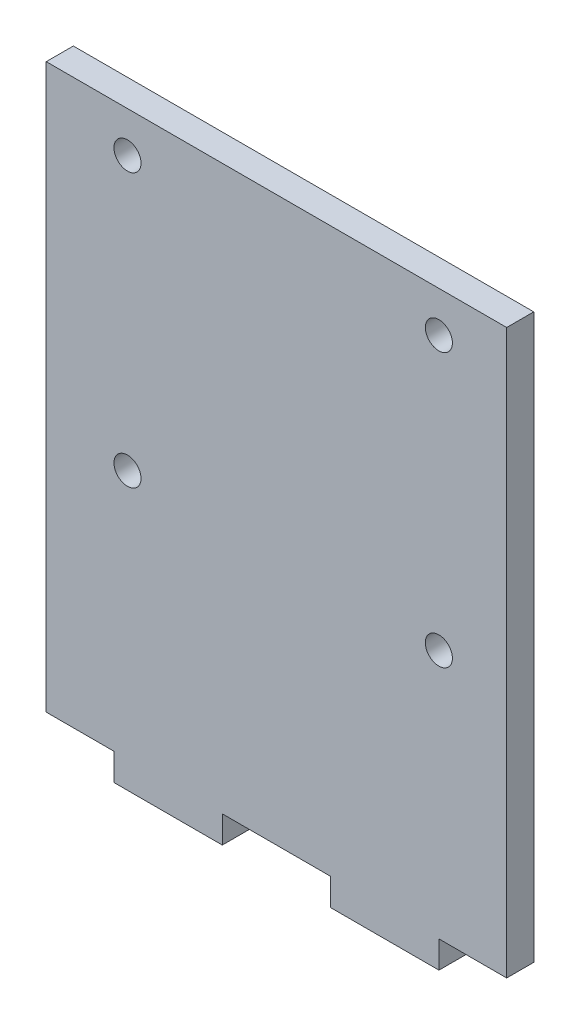
ISO-10303-21;
HEADER;
FILE_DESCRIPTION(('STEP AP214'),'2;1');
FILE_NAME('part.step','',(''),(''),'','','');
FILE_SCHEMA(('AUTOMOTIVE_DESIGN { 1 0 10303 214 1 1 1 1 }'));
ENDSEC;
DATA;
#1=APPLICATION_CONTEXT('core data for automotive mechanical design processes');
#2=APPLICATION_PROTOCOL_DEFINITION('international standard','automotive_design',2000,#1);
#3=PRODUCT_CONTEXT('',#1,'mechanical');
#4=PRODUCT('Part','Part','',(#3));
#5=PRODUCT_RELATED_PRODUCT_CATEGORY('part','',(#4));
#6=PRODUCT_DEFINITION_FORMATION('','',#4);
#7=PRODUCT_DEFINITION_CONTEXT('part definition',#1,'design');
#8=PRODUCT_DEFINITION('design','',#6,#7);
#9=PRODUCT_DEFINITION_SHAPE('','',#8);
#10=(LENGTH_UNIT() NAMED_UNIT(*) SI_UNIT(.MILLI.,.METRE.));
#11=(NAMED_UNIT(*) PLANE_ANGLE_UNIT() SI_UNIT($,.RADIAN.));
#12=(NAMED_UNIT(*) SI_UNIT($,.STERADIAN.) SOLID_ANGLE_UNIT());
#13=UNCERTAINTY_MEASURE_WITH_UNIT(LENGTH_MEASURE(1.E-05),#10,'distance_accuracy_value','');
#14=(GEOMETRIC_REPRESENTATION_CONTEXT(3) GLOBAL_UNCERTAINTY_ASSIGNED_CONTEXT((#13)) GLOBAL_UNIT_ASSIGNED_CONTEXT((#10,
#11,#12)) REPRESENTATION_CONTEXT('',''));
#15=CARTESIAN_POINT('',(0.,0.,0.));
#16=DIRECTION('',(0.,0.,1.));
#17=DIRECTION('',(1.,0.,0.));
#18=AXIS2_PLACEMENT_3D('',#15,#16,#17);
#19=CARTESIAN_POINT('',(53.975,0.,3.175));
#20=DIRECTION('',(-1.,0.,0.));
#21=DIRECTION('',(0.,0.,1.));
#22=AXIS2_PLACEMENT_3D('',#19,#20,#21);
#23=PLANE('',#22);
#24=DIRECTION('',(0.,1.,0.));
#25=VECTOR('',#24,1.);
#26=CARTESIAN_POINT('',(53.975,0.,0.));
#27=LINE('',#26,#25);
#28=CARTESIAN_POINT('',(53.975,0.,0.));
#29=VERTEX_POINT('',#28);
#30=CARTESIAN_POINT('',(53.975,66.04,0.));
#31=VERTEX_POINT('',#30);
#32=EDGE_CURVE('E165',#29,#31,#27,.T.);
#33=ORIENTED_EDGE('',*,*,#32,.T.);
#34=DIRECTION('',(0.,0.,-1.));
#35=VECTOR('',#34,1.);
#36=CARTESIAN_POINT('',(53.975,66.04,3.175));
#37=LINE('',#36,#35);
#38=CARTESIAN_POINT('',(53.975,66.04,3.175));
#39=VERTEX_POINT('',#38);
#40=EDGE_CURVE('E11',#39,#31,#37,.T.);
#41=ORIENTED_EDGE('',*,*,#40,.F.);
#42=DIRECTION('',(0.,1.,0.));
#43=VECTOR('',#42,1.);
#44=CARTESIAN_POINT('',(53.975,0.,3.175));
#45=LINE('',#44,#43);
#46=CARTESIAN_POINT('',(53.975,0.,3.175));
#47=VERTEX_POINT('',#46);
#48=EDGE_CURVE('E100',#47,#39,#45,.T.);
#49=ORIENTED_EDGE('',*,*,#48,.F.);
#50=DIRECTION('',(0.,0.,-1.));
#51=VECTOR('',#50,1.);
#52=CARTESIAN_POINT('',(53.975,0.,3.175));
#53=LINE('',#52,#51);
#54=EDGE_CURVE('E149',#47,#29,#53,.T.);
#55=ORIENTED_EDGE('',*,*,#54,.T.);
#56=EDGE_LOOP('',(#33,#41,#49,#55));
#57=FACE_BOUND('',#56,.T.);
#58=ADVANCED_FACE('F35',(#57),#23,.F.);
#59=CARTESIAN_POINT('',(0.,66.04,3.175));
#60=DIRECTION('',(0.,1.,0.));
#61=DIRECTION('',(-1.,0.,0.));
#62=AXIS2_PLACEMENT_3D('',#59,#60,#61);
#63=PLANE('',#62);
#64=DIRECTION('',(1.,0.,0.));
#65=VECTOR('',#64,1.);
#66=CARTESIAN_POINT('',(0.,66.04,0.));
#67=LINE('',#66,#65);
#68=CARTESIAN_POINT('',(0.,66.04,0.));
#69=VERTEX_POINT('',#68);
#70=EDGE_CURVE('E168',#69,#31,#67,.T.);
#71=ORIENTED_EDGE('',*,*,#70,.F.);
#72=DIRECTION('',(0.,0.,-1.));
#73=VECTOR('',#72,1.);
#74=CARTESIAN_POINT('',(0.,66.04,3.175));
#75=LINE('',#74,#73);
#76=CARTESIAN_POINT('',(0.,66.04,3.175));
#77=VERTEX_POINT('',#76);
#78=EDGE_CURVE('E44',#77,#69,#75,.T.);
#79=ORIENTED_EDGE('',*,*,#78,.F.);
#80=DIRECTION('',(1.,0.,0.));
#81=VECTOR('',#80,1.);
#82=CARTESIAN_POINT('',(0.,66.04,3.175));
#83=LINE('',#82,#81);
#84=EDGE_CURVE('E442',#77,#39,#83,.T.);
#85=ORIENTED_EDGE('',*,*,#84,.T.);
#86=ORIENTED_EDGE('',*,*,#40,.T.);
#87=EDGE_LOOP('',(#71,#79,#85,#86));
#88=FACE_BOUND('',#87,.T.);
#89=ADVANCED_FACE('F220',(#88),#63,.T.);
#90=CARTESIAN_POINT('',(0.,0.,3.175));
#91=DIRECTION('',(-1.,0.,0.));
#92=DIRECTION('',(0.,-1.,0.));
#93=AXIS2_PLACEMENT_3D('',#90,#91,#92);
#94=PLANE('',#93);
#95=DIRECTION('',(0.,1.,0.));
#96=VECTOR('',#95,1.);
#97=CARTESIAN_POINT('',(0.,0.,0.));
#98=LINE('',#97,#96);
#99=CARTESIAN_POINT('',(0.,0.,0.));
#100=VERTEX_POINT('',#99);
#101=EDGE_CURVE('E171',#100,#69,#98,.T.);
#102=ORIENTED_EDGE('',*,*,#101,.F.);
#103=DIRECTION('',(0.,0.,-1.));
#104=VECTOR('',#103,1.);
#105=CARTESIAN_POINT('',(0.,0.,3.175));
#106=LINE('',#105,#104);
#107=CARTESIAN_POINT('',(0.,0.,3.175));
#108=VERTEX_POINT('',#107);
#109=EDGE_CURVE('E210',#108,#100,#106,.T.);
#110=ORIENTED_EDGE('',*,*,#109,.F.);
#111=DIRECTION('',(0.,1.,0.));
#112=VECTOR('',#111,1.);
#113=CARTESIAN_POINT('',(0.,0.,3.175));
#114=LINE('',#113,#112);
#115=EDGE_CURVE('E217',#108,#77,#114,.T.);
#116=ORIENTED_EDGE('',*,*,#115,.T.);
#117=ORIENTED_EDGE('',*,*,#78,.T.);
#118=EDGE_LOOP('',(#102,#110,#116,#117));
#119=FACE_BOUND('',#118,.T.);
#120=ADVANCED_FACE('F215',(#119),#94,.T.);
#121=CARTESIAN_POINT('',(0.,0.,3.175));
#122=DIRECTION('',(0.,1.,0.));
#123=DIRECTION('',(0.,0.,1.));
#124=AXIS2_PLACEMENT_3D('',#121,#122,#123);
#125=PLANE('',#124);
#126=DIRECTION('',(1.,0.,0.));
#127=VECTOR('',#126,1.);
#128=CARTESIAN_POINT('',(0.,0.,0.));
#129=LINE('',#128,#127);
#130=CARTESIAN_POINT('',(7.9375,0.,0.));
#131=VERTEX_POINT('',#130);
#132=EDGE_CURVE('E174',#100,#131,#129,.T.);
#133=ORIENTED_EDGE('',*,*,#132,.T.);
#134=DIRECTION('',(0.,0.,-1.));
#135=VECTOR('',#134,1.);
#136=CARTESIAN_POINT('',(7.9375,0.,3.175));
#137=LINE('',#136,#135);
#138=CARTESIAN_POINT('',(7.9375,0.,3.175));
#139=VERTEX_POINT('',#138);
#140=EDGE_CURVE('E207',#139,#131,#137,.T.);
#141=ORIENTED_EDGE('',*,*,#140,.F.);
#142=DIRECTION('',(1.,0.,0.));
#143=VECTOR('',#142,1.);
#144=CARTESIAN_POINT('',(0.,0.,3.175));
#145=LINE('',#144,#143);
#146=EDGE_CURVE('E238',#108,#139,#145,.T.);
#147=ORIENTED_EDGE('',*,*,#146,.F.);
#148=ORIENTED_EDGE('',*,*,#109,.T.);
#149=EDGE_LOOP('',(#133,#141,#147,#148));
#150=FACE_BOUND('',#149,.T.);
#151=ADVANCED_FACE('F229',(#150),#125,.F.);
#152=CARTESIAN_POINT('',(7.9375,0.,3.175));
#153=DIRECTION('',(1.,0.,0.));
#154=DIRECTION('',(0.,1.,0.));
#155=AXIS2_PLACEMENT_3D('',#152,#153,#154);
#156=PLANE('',#155);
#157=DIRECTION('',(0.,-1.,0.));
#158=VECTOR('',#157,1.);
#159=CARTESIAN_POINT('',(7.9375,0.,0.));
#160=LINE('',#159,#158);
#161=CARTESIAN_POINT('',(7.9375,-3.175,0.));
#162=VERTEX_POINT('',#161);
#163=EDGE_CURVE('E176',#131,#162,#160,.T.);
#164=ORIENTED_EDGE('',*,*,#163,.T.);
#165=DIRECTION('',(0.,0.,-1.));
#166=VECTOR('',#165,1.);
#167=CARTESIAN_POINT('',(7.9375,-3.175,3.175));
#168=LINE('',#167,#166);
#169=CARTESIAN_POINT('',(7.9375,-3.175,3.175));
#170=VERTEX_POINT('',#169);
#171=EDGE_CURVE('E204',#170,#162,#168,.T.);
#172=ORIENTED_EDGE('',*,*,#171,.F.);
#173=DIRECTION('',(0.,-1.,0.));
#174=VECTOR('',#173,1.);
#175=CARTESIAN_POINT('',(7.9375,0.,3.175));
#176=LINE('',#175,#174);
#177=EDGE_CURVE('E235',#139,#170,#176,.T.);
#178=ORIENTED_EDGE('',*,*,#177,.F.);
#179=ORIENTED_EDGE('',*,*,#140,.T.);
#180=EDGE_LOOP('',(#164,#172,#178,#179));
#181=FACE_BOUND('',#180,.T.);
#182=ADVANCED_FACE('F233',(#181),#156,.F.);
#183=CARTESIAN_POINT('',(0.,-3.175,3.175));
#184=DIRECTION('',(0.,1.,0.));
#185=DIRECTION('',(0.,0.,1.));
#186=AXIS2_PLACEMENT_3D('',#183,#184,#185);
#187=PLANE('',#186);
#188=DIRECTION('',(1.,0.,0.));
#189=VECTOR('',#188,1.);
#190=CARTESIAN_POINT('',(0.,-3.175,0.));
#191=LINE('',#190,#189);
#192=CARTESIAN_POINT('',(20.6375,-3.175,0.));
#193=VERTEX_POINT('',#192);
#194=EDGE_CURVE('E178',#162,#193,#191,.T.);
#195=ORIENTED_EDGE('',*,*,#194,.T.);
#196=DIRECTION('',(0.,0.,-1.));
#197=VECTOR('',#196,1.);
#198=CARTESIAN_POINT('',(20.6375,-3.175,3.175));
#199=LINE('',#198,#197);
#200=CARTESIAN_POINT('',(20.6375,-3.175,3.175));
#201=VERTEX_POINT('',#200);
#202=EDGE_CURVE('E201',#201,#193,#199,.T.);
#203=ORIENTED_EDGE('',*,*,#202,.F.);
#204=DIRECTION('',(1.,0.,0.));
#205=VECTOR('',#204,1.);
#206=CARTESIAN_POINT('',(0.,-3.175,3.175));
#207=LINE('',#206,#205);
#208=EDGE_CURVE('E237',#170,#201,#207,.T.);
#209=ORIENTED_EDGE('',*,*,#208,.F.);
#210=ORIENTED_EDGE('',*,*,#171,.T.);
#211=EDGE_LOOP('',(#195,#203,#209,#210));
#212=FACE_BOUND('',#211,.T.);
#213=ADVANCED_FACE('F376',(#212),#187,.F.);
#214=CARTESIAN_POINT('',(20.6375,0.,3.175));
#215=DIRECTION('',(-1.,0.,0.));
#216=DIRECTION('',(0.,0.,1.));
#217=AXIS2_PLACEMENT_3D('',#214,#215,#216);
#218=PLANE('',#217);
#219=DIRECTION('',(0.,1.,0.));
#220=VECTOR('',#219,1.);
#221=CARTESIAN_POINT('',(20.6375,0.,0.));
#222=LINE('',#221,#220);
#223=CARTESIAN_POINT('',(20.6375,0.,0.));
#224=VERTEX_POINT('',#223);
#225=EDGE_CURVE('E180',#193,#224,#222,.T.);
#226=ORIENTED_EDGE('',*,*,#225,.T.);
#227=DIRECTION('',(0.,0.,-1.));
#228=VECTOR('',#227,1.);
#229=CARTESIAN_POINT('',(20.6375,0.,3.175));
#230=LINE('',#229,#228);
#231=CARTESIAN_POINT('',(20.6375,0.,3.175));
#232=VERTEX_POINT('',#231);
#233=EDGE_CURVE('E198',#232,#224,#230,.T.);
#234=ORIENTED_EDGE('',*,*,#233,.F.);
#235=DIRECTION('',(0.,1.,0.));
#236=VECTOR('',#235,1.);
#237=CARTESIAN_POINT('',(20.6375,0.,3.175));
#238=LINE('',#237,#236);
#239=EDGE_CURVE('E240',#201,#232,#238,.T.);
#240=ORIENTED_EDGE('',*,*,#239,.F.);
#241=ORIENTED_EDGE('',*,*,#202,.T.);
#242=EDGE_LOOP('',(#226,#234,#240,#241));
#243=FACE_BOUND('',#242,.T.);
#244=ADVANCED_FACE('F366',(#243),#218,.F.);
#245=CARTESIAN_POINT('',(0.,0.,3.175));
#246=DIRECTION('',(0.,1.,0.));
#247=DIRECTION('',(-1.,0.,0.));
#248=AXIS2_PLACEMENT_3D('',#245,#246,#247);
#249=PLANE('',#248);
#250=DIRECTION('',(1.,0.,0.));
#251=VECTOR('',#250,1.);
#252=CARTESIAN_POINT('',(0.,0.,0.));
#253=LINE('',#252,#251);
#254=CARTESIAN_POINT('',(33.3375,0.,0.));
#255=VERTEX_POINT('',#254);
#256=EDGE_CURVE('E182',#224,#255,#253,.T.);
#257=ORIENTED_EDGE('',*,*,#256,.T.);
#258=DIRECTION('',(0.,0.,-1.));
#259=VECTOR('',#258,1.);
#260=CARTESIAN_POINT('',(33.3375,0.,3.175));
#261=LINE('',#260,#259);
#262=CARTESIAN_POINT('',(33.3375,0.,3.175));
#263=VERTEX_POINT('',#262);
#264=EDGE_CURVE('E196',#263,#255,#261,.T.);
#265=ORIENTED_EDGE('',*,*,#264,.F.);
#266=DIRECTION('',(1.,0.,0.));
#267=VECTOR('',#266,1.);
#268=CARTESIAN_POINT('',(0.,0.,3.175));
#269=LINE('',#268,#267);
#270=EDGE_CURVE('E246',#232,#263,#269,.T.);
#271=ORIENTED_EDGE('',*,*,#270,.F.);
#272=ORIENTED_EDGE('',*,*,#233,.T.);
#273=EDGE_LOOP('',(#257,#265,#271,#272));
#274=FACE_BOUND('',#273,.T.);
#275=ADVANCED_FACE('F357',(#274),#249,.F.);
#276=CARTESIAN_POINT('',(33.3375,0.,3.175));
#277=DIRECTION('',(-1.,0.,0.));
#278=DIRECTION('',(0.,0.,1.));
#279=AXIS2_PLACEMENT_3D('',#276,#277,#278);
#280=PLANE('',#279);
#281=DIRECTION('',(0.,1.,0.));
#282=VECTOR('',#281,1.);
#283=CARTESIAN_POINT('',(33.3375,0.,0.));
#284=LINE('',#283,#282);
#285=CARTESIAN_POINT('',(33.3375,-3.175,0.));
#286=VERTEX_POINT('',#285);
#287=EDGE_CURVE('E185',#286,#255,#284,.T.);
#288=ORIENTED_EDGE('',*,*,#287,.F.);
#289=DIRECTION('',(0.,0.,-1.));
#290=VECTOR('',#289,1.);
#291=CARTESIAN_POINT('',(33.3375,-3.175,3.175));
#292=LINE('',#291,#290);
#293=CARTESIAN_POINT('',(33.3375,-3.175,3.175));
#294=VERTEX_POINT('',#293);
#295=EDGE_CURVE('E139',#294,#286,#292,.T.);
#296=ORIENTED_EDGE('',*,*,#295,.F.);
#297=DIRECTION('',(0.,1.,0.));
#298=VECTOR('',#297,1.);
#299=CARTESIAN_POINT('',(33.3375,0.,3.175));
#300=LINE('',#299,#298);
#301=EDGE_CURVE('E145',#294,#263,#300,.T.);
#302=ORIENTED_EDGE('',*,*,#301,.T.);
#303=ORIENTED_EDGE('',*,*,#264,.T.);
#304=EDGE_LOOP('',(#288,#296,#302,#303));
#305=FACE_BOUND('',#304,.T.);
#306=ADVANCED_FACE('F249',(#305),#280,.T.);
#307=CARTESIAN_POINT('',(0.,-3.17500000000001,3.175));
#308=DIRECTION('',(0.,-1.,0.));
#309=DIRECTION('',(1.,0.,0.));
#310=AXIS2_PLACEMENT_3D('',#307,#308,#309);
#311=PLANE('',#310);
#312=DIRECTION('',(-1.,0.,0.));
#313=VECTOR('',#312,1.);
#314=CARTESIAN_POINT('',(0.,-3.17500000000001,0.));
#315=LINE('',#314,#313);
#316=CARTESIAN_POINT('',(46.0375,-3.17499999999999,0.));
#317=VERTEX_POINT('',#316);
#318=EDGE_CURVE('E134',#317,#286,#315,.T.);
#319=ORIENTED_EDGE('',*,*,#318,.F.);
#320=DIRECTION('',(0.,0.,-1.));
#321=VECTOR('',#320,1.);
#322=CARTESIAN_POINT('',(46.0375,-3.17499999999999,3.175));
#323=LINE('',#322,#321);
#324=CARTESIAN_POINT('',(46.0375,-3.17499999999999,3.175));
#325=VERTEX_POINT('',#324);
#326=EDGE_CURVE('E129',#325,#317,#323,.T.);
#327=ORIENTED_EDGE('',*,*,#326,.F.);
#328=DIRECTION('',(-1.,0.,0.));
#329=VECTOR('',#328,1.);
#330=CARTESIAN_POINT('',(0.,-3.17500000000001,3.175));
#331=LINE('',#330,#329);
#332=EDGE_CURVE('E132',#325,#294,#331,.T.);
#333=ORIENTED_EDGE('',*,*,#332,.T.);
#334=ORIENTED_EDGE('',*,*,#295,.T.);
#335=EDGE_LOOP('',(#319,#327,#333,#334));
#336=FACE_BOUND('',#335,.T.);
#337=ADVANCED_FACE('F131',(#336),#311,.T.);
#338=CARTESIAN_POINT('',(46.0375,0.,3.175));
#339=DIRECTION('',(1.,0.,0.));
#340=DIRECTION('',(0.,0.,-1.));
#341=AXIS2_PLACEMENT_3D('',#338,#339,#340);
#342=PLANE('',#341);
#343=DIRECTION('',(0.,-1.,0.));
#344=VECTOR('',#343,1.);
#345=CARTESIAN_POINT('',(46.0375,0.,0.));
#346=LINE('',#345,#344);
#347=CARTESIAN_POINT('',(46.0375,0.,0.));
#348=VERTEX_POINT('',#347);
#349=EDGE_CURVE('E189',#348,#317,#346,.T.);
#350=ORIENTED_EDGE('',*,*,#349,.F.);
#351=DIRECTION('',(0.,0.,-1.));
#352=VECTOR('',#351,1.);
#353=CARTESIAN_POINT('',(46.0375,0.,3.175));
#354=LINE('',#353,#352);
#355=CARTESIAN_POINT('',(46.0375,0.,3.175));
#356=VERTEX_POINT('',#355);
#357=EDGE_CURVE('E91',#356,#348,#354,.T.);
#358=ORIENTED_EDGE('',*,*,#357,.F.);
#359=DIRECTION('',(0.,-1.,0.));
#360=VECTOR('',#359,1.);
#361=CARTESIAN_POINT('',(46.0375,0.,3.175));
#362=LINE('',#361,#360);
#363=EDGE_CURVE('E143',#356,#325,#362,.T.);
#364=ORIENTED_EDGE('',*,*,#363,.T.);
#365=ORIENTED_EDGE('',*,*,#326,.T.);
#366=EDGE_LOOP('',(#350,#358,#364,#365));
#367=FACE_BOUND('',#366,.T.);
#368=ADVANCED_FACE('F147',(#367),#342,.T.);
#369=CARTESIAN_POINT('',(46.025,61.2775,3.175));
#370=DIRECTION('',(0.,0.,-1.));
#371=DIRECTION('',(-1.,0.,0.));
#372=AXIS2_PLACEMENT_3D('',#369,#370,#371);
#373=CYLINDRICAL_SURFACE('',#372,1.5875);
#374=CARTESIAN_POINT('',(46.025,61.2775,3.175));
#375=DIRECTION('',(0.,0.,1.));
#376=DIRECTION('',(1.,0.,0.));
#377=AXIS2_PLACEMENT_3D('',#374,#375,#376);
#378=CIRCLE('',#377,1.5875);
#379=CARTESIAN_POINT('',(47.6125,61.2775,3.175));
#380=VERTEX_POINT('',#379);
#381=EDGE_CURVE('E434',#380,#380,#378,.T.);
#382=ORIENTED_EDGE('',*,*,#381,.T.);
#383=EDGE_LOOP('',(#382));
#384=FACE_BOUND('',#383,.T.);
#385=CARTESIAN_POINT('',(46.025,61.2775,0.));
#386=DIRECTION('',(0.,0.,1.));
#387=DIRECTION('',(1.,0.,0.));
#388=AXIS2_PLACEMENT_3D('',#385,#386,#387);
#389=CIRCLE('',#388,1.5875);
#390=CARTESIAN_POINT('',(47.6125,61.2775,0.));
#391=VERTEX_POINT('',#390);
#392=EDGE_CURVE('E162',#391,#391,#389,.T.);
#393=ORIENTED_EDGE('',*,*,#392,.F.);
#394=EDGE_LOOP('',(#393));
#395=FACE_BOUND('',#394,.T.);
#396=ADVANCED_FACE('F274',(#384,#395),#373,.F.);
#397=CARTESIAN_POINT('',(46.025,29.2775,3.175));
#398=DIRECTION('',(0.,0.,-1.));
#399=DIRECTION('',(-1.,0.,0.));
#400=AXIS2_PLACEMENT_3D('',#397,#398,#399);
#401=CYLINDRICAL_SURFACE('',#400,1.5875);
#402=CARTESIAN_POINT('',(46.025,29.2775,3.175));
#403=DIRECTION('',(0.,0.,1.));
#404=DIRECTION('',(1.,0.,0.));
#405=AXIS2_PLACEMENT_3D('',#402,#403,#404);
#406=CIRCLE('',#405,1.5875);
#407=CARTESIAN_POINT('',(47.6125,29.2775,3.175));
#408=VERTEX_POINT('',#407);
#409=EDGE_CURVE('E431',#408,#408,#406,.T.);
#410=ORIENTED_EDGE('',*,*,#409,.T.);
#411=EDGE_LOOP('',(#410));
#412=FACE_BOUND('',#411,.T.);
#413=CARTESIAN_POINT('',(46.025,29.2775,0.));
#414=DIRECTION('',(0.,0.,1.));
#415=DIRECTION('',(1.,0.,0.));
#416=AXIS2_PLACEMENT_3D('',#413,#414,#415);
#417=CIRCLE('',#416,1.5875);
#418=CARTESIAN_POINT('',(47.6125,29.2775,0.));
#419=VERTEX_POINT('',#418);
#420=EDGE_CURVE('E159',#419,#419,#417,.T.);
#421=ORIENTED_EDGE('',*,*,#420,.F.);
#422=EDGE_LOOP('',(#421));
#423=FACE_BOUND('',#422,.T.);
#424=ADVANCED_FACE('F277',(#412,#423),#401,.F.);
#425=CARTESIAN_POINT('',(9.525,61.2775,3.175));
#426=DIRECTION('',(0.,0.,-1.));
#427=DIRECTION('',(-1.,0.,0.));
#428=AXIS2_PLACEMENT_3D('',#425,#426,#427);
#429=CYLINDRICAL_SURFACE('',#428,1.5875);
#430=CARTESIAN_POINT('',(9.525,61.2775,3.175));
#431=DIRECTION('',(0.,0.,1.));
#432=DIRECTION('',(1.,0.,0.));
#433=AXIS2_PLACEMENT_3D('',#430,#431,#432);
#434=CIRCLE('',#433,1.5875);
#435=CARTESIAN_POINT('',(11.1125,61.2775,3.175));
#436=VERTEX_POINT('',#435);
#437=EDGE_CURVE('E288',#436,#436,#434,.T.);
#438=ORIENTED_EDGE('',*,*,#437,.T.);
#439=EDGE_LOOP('',(#438));
#440=FACE_BOUND('',#439,.T.);
#441=CARTESIAN_POINT('',(9.525,61.2775,0.));
#442=DIRECTION('',(0.,0.,1.));
#443=DIRECTION('',(1.,0.,0.));
#444=AXIS2_PLACEMENT_3D('',#441,#442,#443);
#445=CIRCLE('',#444,1.5875);
#446=CARTESIAN_POINT('',(11.1125,61.2775,0.));
#447=VERTEX_POINT('',#446);
#448=EDGE_CURVE('E156',#447,#447,#445,.T.);
#449=ORIENTED_EDGE('',*,*,#448,.F.);
#450=EDGE_LOOP('',(#449));
#451=FACE_BOUND('',#450,.T.);
#452=ADVANCED_FACE('F262',(#440,#451),#429,.F.);
#453=CARTESIAN_POINT('',(9.52500000000001,29.2775,3.175));
#454=DIRECTION('',(0.,0.,-1.));
#455=DIRECTION('',(-1.,0.,0.));
#456=AXIS2_PLACEMENT_3D('',#453,#454,#455);
#457=CYLINDRICAL_SURFACE('',#456,1.5875);
#458=CARTESIAN_POINT('',(9.52500000000001,29.2775,3.175));
#459=DIRECTION('',(0.,0.,1.));
#460=DIRECTION('',(1.,0.,0.));
#461=AXIS2_PLACEMENT_3D('',#458,#459,#460);
#462=CIRCLE('',#461,1.5875);
#463=CARTESIAN_POINT('',(11.1125,29.2775,3.175));
#464=VERTEX_POINT('',#463);
#465=EDGE_CURVE('E192',#464,#464,#462,.T.);
#466=ORIENTED_EDGE('',*,*,#465,.T.);
#467=EDGE_LOOP('',(#466));
#468=FACE_BOUND('',#467,.T.);
#469=CARTESIAN_POINT('',(9.52500000000001,29.2775,0.));
#470=DIRECTION('',(0.,0.,1.));
#471=DIRECTION('',(1.,0.,0.));
#472=AXIS2_PLACEMENT_3D('',#469,#470,#471);
#473=CIRCLE('',#472,1.5875);
#474=CARTESIAN_POINT('',(11.1125,29.2775,0.));
#475=VERTEX_POINT('',#474);
#476=EDGE_CURVE('E153',#475,#475,#473,.T.);
#477=ORIENTED_EDGE('',*,*,#476,.F.);
#478=EDGE_LOOP('',(#477));
#479=FACE_BOUND('',#478,.T.);
#480=ADVANCED_FACE('F37',(#468,#479),#457,.F.);
#481=CARTESIAN_POINT('',(0.,0.,3.175));
#482=DIRECTION('',(0.,1.,0.));
#483=DIRECTION('',(-1.,0.,0.));
#484=AXIS2_PLACEMENT_3D('',#481,#482,#483);
#485=PLANE('',#484);
#486=DIRECTION('',(1.,0.,0.));
#487=VECTOR('',#486,1.);
#488=CARTESIAN_POINT('',(0.,0.,0.));
#489=LINE('',#488,#487);
#490=EDGE_CURVE('E94',#348,#29,#489,.T.);
#491=ORIENTED_EDGE('',*,*,#490,.T.);
#492=ORIENTED_EDGE('',*,*,#54,.F.);
#493=DIRECTION('',(1.,0.,0.));
#494=VECTOR('',#493,1.);
#495=CARTESIAN_POINT('',(0.,0.,3.175));
#496=LINE('',#495,#494);
#497=EDGE_CURVE('E52',#356,#47,#496,.T.);
#498=ORIENTED_EDGE('',*,*,#497,.F.);
#499=ORIENTED_EDGE('',*,*,#357,.T.);
#500=EDGE_LOOP('',(#491,#492,#498,#499));
#501=FACE_BOUND('',#500,.T.);
#502=ADVANCED_FACE('F253',(#501),#485,.F.);
#503=CARTESIAN_POINT('',(0.,0.,3.175));
#504=DIRECTION('',(0.,0.,1.));
#505=DIRECTION('',(1.,0.,0.));
#506=AXIS2_PLACEMENT_3D('',#503,#504,#505);
#507=PLANE('',#506);
#508=ORIENTED_EDGE('',*,*,#465,.F.);
#509=EDGE_LOOP('',(#508));
#510=FACE_BOUND('',#509,.T.);
#511=ORIENTED_EDGE('',*,*,#437,.F.);
#512=EDGE_LOOP('',(#511));
#513=FACE_BOUND('',#512,.T.);
#514=ORIENTED_EDGE('',*,*,#409,.F.);
#515=EDGE_LOOP('',(#514));
#516=FACE_BOUND('',#515,.T.);
#517=ORIENTED_EDGE('',*,*,#381,.F.);
#518=EDGE_LOOP('',(#517));
#519=FACE_BOUND('',#518,.T.);
#520=ORIENTED_EDGE('',*,*,#48,.T.);
#521=ORIENTED_EDGE('',*,*,#84,.F.);
#522=ORIENTED_EDGE('',*,*,#115,.F.);
#523=ORIENTED_EDGE('',*,*,#146,.T.);
#524=ORIENTED_EDGE('',*,*,#177,.T.);
#525=ORIENTED_EDGE('',*,*,#208,.T.);
#526=ORIENTED_EDGE('',*,*,#239,.T.);
#527=ORIENTED_EDGE('',*,*,#270,.T.);
#528=ORIENTED_EDGE('',*,*,#301,.F.);
#529=ORIENTED_EDGE('',*,*,#332,.F.);
#530=ORIENTED_EDGE('',*,*,#363,.F.);
#531=ORIENTED_EDGE('',*,*,#497,.T.);
#532=EDGE_LOOP('',(#520,#521,#522,#523,#524,#525,#526,#527,#528,#529,#530,#531));
#533=FACE_BOUND('',#532,.T.);
#534=ADVANCED_FACE('F142',(#510,#513,#516,#519,#533),#507,.T.);
#535=CARTESIAN_POINT('',(0.,0.,0.));
#536=DIRECTION('',(0.,0.,1.));
#537=DIRECTION('',(1.,0.,0.));
#538=AXIS2_PLACEMENT_3D('',#535,#536,#537);
#539=PLANE('',#538);
#540=ORIENTED_EDGE('',*,*,#476,.T.);
#541=EDGE_LOOP('',(#540));
#542=FACE_BOUND('',#541,.T.);
#543=ORIENTED_EDGE('',*,*,#448,.T.);
#544=EDGE_LOOP('',(#543));
#545=FACE_BOUND('',#544,.T.);
#546=ORIENTED_EDGE('',*,*,#420,.T.);
#547=EDGE_LOOP('',(#546));
#548=FACE_BOUND('',#547,.T.);
#549=ORIENTED_EDGE('',*,*,#392,.T.);
#550=EDGE_LOOP('',(#549));
#551=FACE_BOUND('',#550,.T.);
#552=ORIENTED_EDGE('',*,*,#32,.F.);
#553=ORIENTED_EDGE('',*,*,#490,.F.);
#554=ORIENTED_EDGE('',*,*,#349,.T.);
#555=ORIENTED_EDGE('',*,*,#318,.T.);
#556=ORIENTED_EDGE('',*,*,#287,.T.);
#557=ORIENTED_EDGE('',*,*,#256,.F.);
#558=ORIENTED_EDGE('',*,*,#225,.F.);
#559=ORIENTED_EDGE('',*,*,#194,.F.);
#560=ORIENTED_EDGE('',*,*,#163,.F.);
#561=ORIENTED_EDGE('',*,*,#132,.F.);
#562=ORIENTED_EDGE('',*,*,#101,.T.);
#563=ORIENTED_EDGE('',*,*,#70,.T.);
#564=EDGE_LOOP('',(#552,#553,#554,#555,#556,#557,#558,#559,#560,#561,#562,#563));
#565=FACE_BOUND('',#564,.T.);
#566=ADVANCED_FACE('F224',(#542,#545,#548,#551,#565),#539,.F.);
#567=CLOSED_SHELL('',(#58,#89,#120,#151,#182,#213,#244,#275,#306,#337,#368,#396,#424,#452,#480,
#502,#534,#566));
#568=MANIFOLD_SOLID_BREP('B2',#567);
#569=ADVANCED_BREP_SHAPE_REPRESENTATION('',(#18,#568),#14);
#570=SHAPE_DEFINITION_REPRESENTATION(#9,#569);
ENDSEC;
END-ISO-10303-21;
